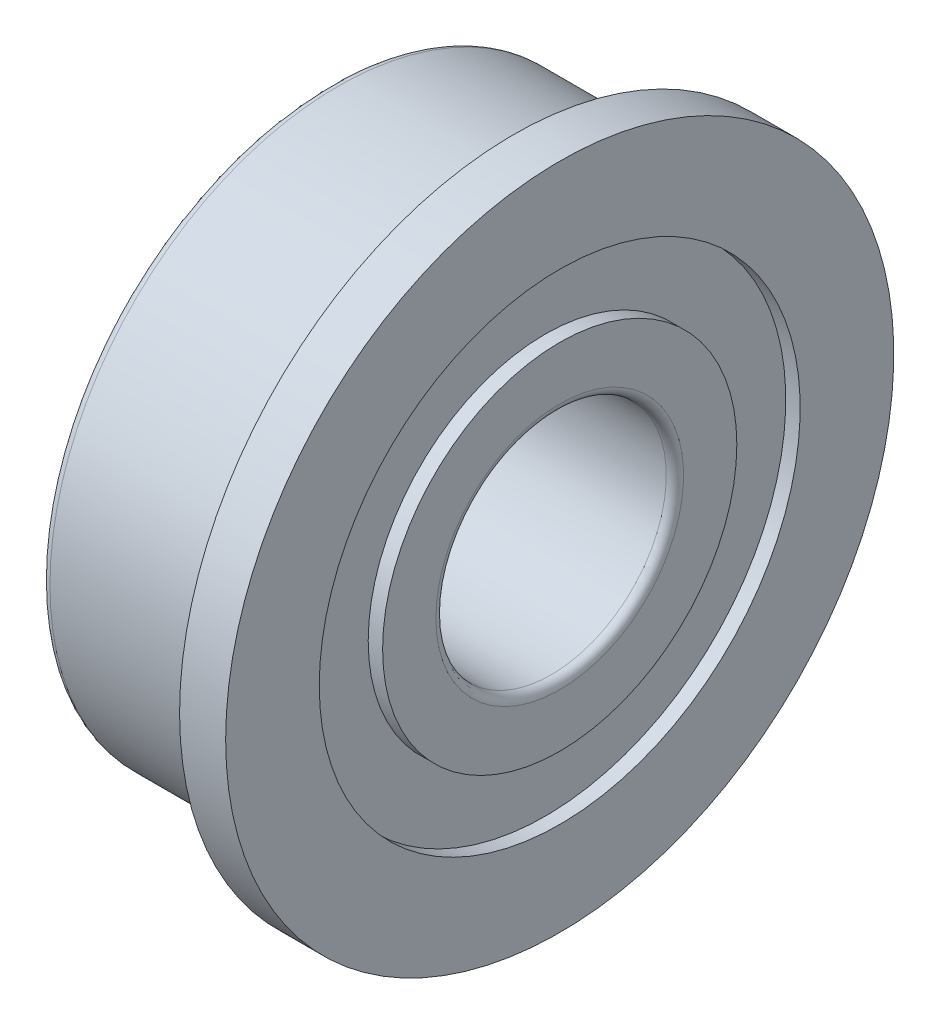
ISO-10303-21;
HEADER;
FILE_DESCRIPTION(('STEP AP214'),'2;1');
FILE_NAME('part.step','',(''),(''),'','','');
FILE_SCHEMA(('AUTOMOTIVE_DESIGN { 1 0 10303 214 1 1 1 1 }'));
ENDSEC;
DATA;
#1=APPLICATION_CONTEXT('core data for automotive mechanical design processes');
#2=APPLICATION_PROTOCOL_DEFINITION('international standard','automotive_design',2000,#1);
#3=PRODUCT_CONTEXT('',#1,'mechanical');
#4=PRODUCT('Part','Part','',(#3));
#5=PRODUCT_RELATED_PRODUCT_CATEGORY('part','',(#4));
#6=PRODUCT_DEFINITION_FORMATION('','',#4);
#7=PRODUCT_DEFINITION_CONTEXT('part definition',#1,'design');
#8=PRODUCT_DEFINITION('design','',#6,#7);
#9=PRODUCT_DEFINITION_SHAPE('','',#8);
#10=(LENGTH_UNIT() NAMED_UNIT(*) SI_UNIT(.MILLI.,.METRE.));
#11=(NAMED_UNIT(*) PLANE_ANGLE_UNIT() SI_UNIT($,.RADIAN.));
#12=(NAMED_UNIT(*) SI_UNIT($,.STERADIAN.) SOLID_ANGLE_UNIT());
#13=UNCERTAINTY_MEASURE_WITH_UNIT(LENGTH_MEASURE(1.E-05),#10,'distance_accuracy_value','');
#14=(GEOMETRIC_REPRESENTATION_CONTEXT(3) GLOBAL_UNCERTAINTY_ASSIGNED_CONTEXT((#13)) GLOBAL_UNIT_ASSIGNED_CONTEXT((#10,
#11,#12)) REPRESENTATION_CONTEXT('',''));
#15=CARTESIAN_POINT('',(0.,0.,0.));
#16=DIRECTION('',(0.,0.,1.));
#17=DIRECTION('',(1.,0.,0.));
#18=AXIS2_PLACEMENT_3D('',#15,#16,#17);
#19=CARTESIAN_POINT('',(0.14999999999997,0.,0.));
#20=DIRECTION('',(-1.,0.,0.));
#21=DIRECTION('',(0.,0.,1.));
#22=AXIS2_PLACEMENT_3D('',#19,#20,#21);
#23=TOROIDAL_SURFACE('',#22,4.85000000000003,0.14999999999997);
#24=CARTESIAN_POINT('',(0.,0.,0.));
#25=DIRECTION('',(-1.,0.,0.));
#26=DIRECTION('',(0.,0.,1.));
#27=AXIS2_PLACEMENT_3D('',#24,#25,#26);
#28=CIRCLE('',#27,4.85);
#29=CARTESIAN_POINT('',(0.,0.,4.85));
#30=VERTEX_POINT('',#29);
#31=EDGE_CURVE('E10',#30,#30,#28,.T.);
#32=ORIENTED_EDGE('',*,*,#31,.F.);
#33=EDGE_LOOP('',(#32));
#34=FACE_BOUND('',#33,.T.);
#35=CARTESIAN_POINT('',(0.150000000000001,0.,0.));
#36=DIRECTION('',(-1.,0.,0.));
#37=DIRECTION('',(0.,0.,1.));
#38=AXIS2_PLACEMENT_3D('',#35,#36,#37);
#39=CIRCLE('',#38,5.);
#40=CARTESIAN_POINT('',(0.150000000000001,0.,5.));
#41=VERTEX_POINT('',#40);
#42=EDGE_CURVE('E89',#41,#41,#39,.T.);
#43=ORIENTED_EDGE('',*,*,#42,.T.);
#44=EDGE_LOOP('',(#43));
#45=FACE_BOUND('',#44,.T.);
#46=ADVANCED_FACE('F31',(#34,#45),#23,.T.);
#47=CARTESIAN_POINT('',(0.,4.85,0.));
#48=DIRECTION('',(1.,0.,0.));
#49=DIRECTION('',(0.,0.,-1.));
#50=AXIS2_PLACEMENT_3D('',#47,#48,#49);
#51=PLANE('',#50);
#52=CARTESIAN_POINT('',(0.,0.,0.));
#53=DIRECTION('',(-1.,0.,0.));
#54=DIRECTION('',(0.,0.,1.));
#55=AXIS2_PLACEMENT_3D('',#52,#53,#54);
#56=CIRCLE('',#55,4.175);
#57=CARTESIAN_POINT('',(0.,0.,4.175));
#58=VERTEX_POINT('',#57);
#59=EDGE_CURVE('E37',#58,#58,#56,.T.);
#60=ORIENTED_EDGE('',*,*,#59,.F.);
#61=EDGE_LOOP('',(#60));
#62=FACE_BOUND('',#61,.T.);
#63=ORIENTED_EDGE('',*,*,#31,.T.);
#64=EDGE_LOOP('',(#63));
#65=FACE_BOUND('',#64,.T.);
#66=ADVANCED_FACE('F186',(#62,#65),#51,.F.);
#67=CARTESIAN_POINT('',(10.,0.,0.));
#68=DIRECTION('',(-1.,0.,0.));
#69=DIRECTION('',(0.,0.,1.));
#70=AXIS2_PLACEMENT_3D('',#67,#68,#69);
#71=CYLINDRICAL_SURFACE('',#70,4.175);
#72=CARTESIAN_POINT('',(0.25,0.,0.));
#73=DIRECTION('',(-1.,0.,0.));
#74=DIRECTION('',(0.,0.,1.));
#75=AXIS2_PLACEMENT_3D('',#72,#73,#74);
#76=CIRCLE('',#75,4.175);
#77=CARTESIAN_POINT('',(0.25,0.,4.175));
#78=VERTEX_POINT('',#77);
#79=EDGE_CURVE('E41',#78,#78,#76,.T.);
#80=ORIENTED_EDGE('',*,*,#79,.F.);
#81=EDGE_LOOP('',(#80));
#82=FACE_BOUND('',#81,.T.);
#83=ORIENTED_EDGE('',*,*,#59,.T.);
#84=EDGE_LOOP('',(#83));
#85=FACE_BOUND('',#84,.T.);
#86=ADVANCED_FACE('F181',(#82,#85),#71,.F.);
#87=CARTESIAN_POINT('',(0.25,4.175,0.));
#88=DIRECTION('',(1.,0.,0.));
#89=DIRECTION('',(0.,0.,-1.));
#90=AXIS2_PLACEMENT_3D('',#87,#88,#89);
#91=PLANE('',#90);
#92=CARTESIAN_POINT('',(0.25,0.,0.));
#93=DIRECTION('',(-1.,0.,0.));
#94=DIRECTION('',(0.,0.,1.));
#95=AXIS2_PLACEMENT_3D('',#92,#93,#94);
#96=CIRCLE('',#95,3.075);
#97=CARTESIAN_POINT('',(0.25,0.,3.075));
#98=VERTEX_POINT('',#97);
#99=EDGE_CURVE('E45',#98,#98,#96,.T.);
#100=ORIENTED_EDGE('',*,*,#99,.F.);
#101=EDGE_LOOP('',(#100));
#102=FACE_BOUND('',#101,.T.);
#103=ORIENTED_EDGE('',*,*,#79,.T.);
#104=EDGE_LOOP('',(#103));
#105=FACE_BOUND('',#104,.T.);
#106=ADVANCED_FACE('F175',(#102,#105),#91,.F.);
#107=CARTESIAN_POINT('',(10.,0.,0.));
#108=DIRECTION('',(-1.,0.,0.));
#109=DIRECTION('',(0.,0.,1.));
#110=AXIS2_PLACEMENT_3D('',#107,#108,#109);
#111=CYLINDRICAL_SURFACE('',#110,3.075);
#112=CARTESIAN_POINT('',(0.,0.,0.));
#113=DIRECTION('',(-1.,0.,0.));
#114=DIRECTION('',(0.,0.,1.));
#115=AXIS2_PLACEMENT_3D('',#112,#113,#114);
#116=CIRCLE('',#115,3.075);
#117=CARTESIAN_POINT('',(0.,0.,3.075));
#118=VERTEX_POINT('',#117);
#119=EDGE_CURVE('E50',#118,#118,#116,.T.);
#120=ORIENTED_EDGE('',*,*,#119,.F.);
#121=EDGE_LOOP('',(#120));
#122=FACE_BOUND('',#121,.T.);
#123=ORIENTED_EDGE('',*,*,#99,.T.);
#124=EDGE_LOOP('',(#123));
#125=FACE_BOUND('',#124,.T.);
#126=ADVANCED_FACE('F169',(#122,#125),#111,.T.);
#127=CARTESIAN_POINT('',(0.,3.075,0.));
#128=DIRECTION('',(1.,0.,0.));
#129=DIRECTION('',(0.,0.,-1.));
#130=AXIS2_PLACEMENT_3D('',#127,#128,#129);
#131=PLANE('',#130);
#132=CARTESIAN_POINT('',(0.,0.,0.));
#133=DIRECTION('',(-1.,0.,0.));
#134=DIRECTION('',(0.,0.,1.));
#135=AXIS2_PLACEMENT_3D('',#132,#133,#134);
#136=CIRCLE('',#135,2.15);
#137=CARTESIAN_POINT('',(0.,0.,2.15));
#138=VERTEX_POINT('',#137);
#139=EDGE_CURVE('E53',#138,#138,#136,.T.);
#140=ORIENTED_EDGE('',*,*,#139,.F.);
#141=EDGE_LOOP('',(#140));
#142=FACE_BOUND('',#141,.T.);
#143=ORIENTED_EDGE('',*,*,#119,.T.);
#144=EDGE_LOOP('',(#143));
#145=FACE_BOUND('',#144,.T.);
#146=ADVANCED_FACE('F163',(#142,#145),#131,.F.);
#147=CARTESIAN_POINT('',(0.149999999999969,0.,0.));
#148=DIRECTION('',(-1.,0.,0.));
#149=DIRECTION('',(0.,0.,1.));
#150=AXIS2_PLACEMENT_3D('',#147,#148,#149);
#151=TOROIDAL_SURFACE('',#150,2.14999999999997,0.149999999999969);
#152=CARTESIAN_POINT('',(0.150000000000001,0.,0.));
#153=DIRECTION('',(-1.,0.,0.));
#154=DIRECTION('',(0.,0.,1.));
#155=AXIS2_PLACEMENT_3D('',#152,#153,#154);
#156=CIRCLE('',#155,2.);
#157=CARTESIAN_POINT('',(0.150000000000001,0.,2.));
#158=VERTEX_POINT('',#157);
#159=EDGE_CURVE('E56',#158,#158,#156,.T.);
#160=ORIENTED_EDGE('',*,*,#159,.F.);
#161=EDGE_LOOP('',(#160));
#162=FACE_BOUND('',#161,.T.);
#163=ORIENTED_EDGE('',*,*,#139,.T.);
#164=EDGE_LOOP('',(#163));
#165=FACE_BOUND('',#164,.T.);
#166=ADVANCED_FACE('F157',(#162,#165),#151,.T.);
#167=CARTESIAN_POINT('',(10.,0.,0.));
#168=DIRECTION('',(-1.,0.,0.));
#169=DIRECTION('',(0.,0.,1.));
#170=AXIS2_PLACEMENT_3D('',#167,#168,#169);
#171=CYLINDRICAL_SURFACE('',#170,2.);
#172=CARTESIAN_POINT('',(3.85,0.,0.));
#173=DIRECTION('',(-1.,0.,0.));
#174=DIRECTION('',(0.,0.,1.));
#175=AXIS2_PLACEMENT_3D('',#172,#173,#174);
#176=CIRCLE('',#175,2.);
#177=CARTESIAN_POINT('',(3.85,0.,2.));
#178=VERTEX_POINT('',#177);
#179=EDGE_CURVE('E59',#178,#178,#176,.T.);
#180=ORIENTED_EDGE('',*,*,#179,.F.);
#181=EDGE_LOOP('',(#180));
#182=FACE_BOUND('',#181,.T.);
#183=ORIENTED_EDGE('',*,*,#159,.T.);
#184=EDGE_LOOP('',(#183));
#185=FACE_BOUND('',#184,.T.);
#186=ADVANCED_FACE('F151',(#182,#185),#171,.F.);
#187=CARTESIAN_POINT('',(3.85000000000006,0.,0.));
#188=DIRECTION('',(-1.,0.,0.));
#189=DIRECTION('',(0.,0.,1.));
#190=AXIS2_PLACEMENT_3D('',#187,#188,#189);
#191=TOROIDAL_SURFACE('',#190,2.14999999999994,0.149999999999939);
#192=CARTESIAN_POINT('',(4.,0.,0.));
#193=DIRECTION('',(-1.,0.,0.));
#194=DIRECTION('',(0.,0.,1.));
#195=AXIS2_PLACEMENT_3D('',#192,#193,#194);
#196=CIRCLE('',#195,2.15);
#197=CARTESIAN_POINT('',(4.,0.,2.15));
#198=VERTEX_POINT('',#197);
#199=EDGE_CURVE('E62',#198,#198,#196,.T.);
#200=ORIENTED_EDGE('',*,*,#199,.F.);
#201=EDGE_LOOP('',(#200));
#202=FACE_BOUND('',#201,.T.);
#203=ORIENTED_EDGE('',*,*,#179,.T.);
#204=EDGE_LOOP('',(#203));
#205=FACE_BOUND('',#204,.T.);
#206=ADVANCED_FACE('F145',(#202,#205),#191,.T.);
#207=CARTESIAN_POINT('',(4.,2.15,0.));
#208=DIRECTION('',(-1.,0.,0.));
#209=DIRECTION('',(0.,0.,1.));
#210=AXIS2_PLACEMENT_3D('',#207,#208,#209);
#211=PLANE('',#210);
#212=CARTESIAN_POINT('',(4.,0.,0.));
#213=DIRECTION('',(-1.,0.,0.));
#214=DIRECTION('',(0.,0.,1.));
#215=AXIS2_PLACEMENT_3D('',#212,#213,#214);
#216=CIRCLE('',#215,3.075);
#217=CARTESIAN_POINT('',(4.,0.,3.075));
#218=VERTEX_POINT('',#217);
#219=EDGE_CURVE('E65',#218,#218,#216,.T.);
#220=ORIENTED_EDGE('',*,*,#219,.F.);
#221=EDGE_LOOP('',(#220));
#222=FACE_BOUND('',#221,.T.);
#223=ORIENTED_EDGE('',*,*,#199,.T.);
#224=EDGE_LOOP('',(#223));
#225=FACE_BOUND('',#224,.T.);
#226=ADVANCED_FACE('F139',(#222,#225),#211,.F.);
#227=CARTESIAN_POINT('',(10.,0.,0.));
#228=DIRECTION('',(-1.,0.,0.));
#229=DIRECTION('',(0.,0.,1.));
#230=AXIS2_PLACEMENT_3D('',#227,#228,#229);
#231=CYLINDRICAL_SURFACE('',#230,3.075);
#232=CARTESIAN_POINT('',(3.75,0.,0.));
#233=DIRECTION('',(-1.,0.,0.));
#234=DIRECTION('',(0.,0.,1.));
#235=AXIS2_PLACEMENT_3D('',#232,#233,#234);
#236=CIRCLE('',#235,3.075);
#237=CARTESIAN_POINT('',(3.75,0.,3.075));
#238=VERTEX_POINT('',#237);
#239=EDGE_CURVE('E68',#238,#238,#236,.T.);
#240=ORIENTED_EDGE('',*,*,#239,.F.);
#241=EDGE_LOOP('',(#240));
#242=FACE_BOUND('',#241,.T.);
#243=ORIENTED_EDGE('',*,*,#219,.T.);
#244=EDGE_LOOP('',(#243));
#245=FACE_BOUND('',#244,.T.);
#246=ADVANCED_FACE('F133',(#242,#245),#231,.T.);
#247=CARTESIAN_POINT('',(3.75,3.075,0.));
#248=DIRECTION('',(-1.,0.,0.));
#249=DIRECTION('',(0.,0.,1.));
#250=AXIS2_PLACEMENT_3D('',#247,#248,#249);
#251=PLANE('',#250);
#252=CARTESIAN_POINT('',(3.75,0.,0.));
#253=DIRECTION('',(-1.,0.,0.));
#254=DIRECTION('',(0.,0.,1.));
#255=AXIS2_PLACEMENT_3D('',#252,#253,#254);
#256=CIRCLE('',#255,4.175);
#257=CARTESIAN_POINT('',(3.75,0.,4.175));
#258=VERTEX_POINT('',#257);
#259=EDGE_CURVE('E71',#258,#258,#256,.T.);
#260=ORIENTED_EDGE('',*,*,#259,.F.);
#261=EDGE_LOOP('',(#260));
#262=FACE_BOUND('',#261,.T.);
#263=ORIENTED_EDGE('',*,*,#239,.T.);
#264=EDGE_LOOP('',(#263));
#265=FACE_BOUND('',#264,.T.);
#266=ADVANCED_FACE('F127',(#262,#265),#251,.F.);
#267=CARTESIAN_POINT('',(10.,0.,0.));
#268=DIRECTION('',(-1.,0.,0.));
#269=DIRECTION('',(0.,0.,1.));
#270=AXIS2_PLACEMENT_3D('',#267,#268,#269);
#271=CYLINDRICAL_SURFACE('',#270,4.175);
#272=CARTESIAN_POINT('',(4.,0.,0.));
#273=DIRECTION('',(-1.,0.,0.));
#274=DIRECTION('',(0.,0.,1.));
#275=AXIS2_PLACEMENT_3D('',#272,#273,#274);
#276=CIRCLE('',#275,4.175);
#277=CARTESIAN_POINT('',(4.,0.,4.175));
#278=VERTEX_POINT('',#277);
#279=EDGE_CURVE('E74',#278,#278,#276,.T.);
#280=ORIENTED_EDGE('',*,*,#279,.F.);
#281=EDGE_LOOP('',(#280));
#282=FACE_BOUND('',#281,.T.);
#283=ORIENTED_EDGE('',*,*,#259,.T.);
#284=EDGE_LOOP('',(#283));
#285=FACE_BOUND('',#284,.T.);
#286=ADVANCED_FACE('F121',(#282,#285),#271,.F.);
#287=CARTESIAN_POINT('',(4.,4.175,0.));
#288=DIRECTION('',(-1.,0.,0.));
#289=DIRECTION('',(0.,0.,1.));
#290=AXIS2_PLACEMENT_3D('',#287,#288,#289);
#291=PLANE('',#290);
#292=CARTESIAN_POINT('',(4.,0.,0.));
#293=DIRECTION('',(-1.,0.,0.));
#294=DIRECTION('',(0.,0.,1.));
#295=AXIS2_PLACEMENT_3D('',#292,#293,#294);
#296=CIRCLE('',#295,5.8);
#297=CARTESIAN_POINT('',(4.,0.,5.8));
#298=VERTEX_POINT('',#297);
#299=EDGE_CURVE('E77',#298,#298,#296,.T.);
#300=ORIENTED_EDGE('',*,*,#299,.F.);
#301=EDGE_LOOP('',(#300));
#302=FACE_BOUND('',#301,.T.);
#303=ORIENTED_EDGE('',*,*,#279,.T.);
#304=EDGE_LOOP('',(#303));
#305=FACE_BOUND('',#304,.T.);
#306=ADVANCED_FACE('F115',(#302,#305),#291,.F.);
#307=CARTESIAN_POINT('',(10.,0.,0.));
#308=DIRECTION('',(-1.,0.,0.));
#309=DIRECTION('',(0.,0.,1.));
#310=AXIS2_PLACEMENT_3D('',#307,#308,#309);
#311=CYLINDRICAL_SURFACE('',#310,5.8);
#312=CARTESIAN_POINT('',(3.2,0.,0.));
#313=DIRECTION('',(-1.,0.,0.));
#314=DIRECTION('',(0.,0.,1.));
#315=AXIS2_PLACEMENT_3D('',#312,#313,#314);
#316=CIRCLE('',#315,5.8);
#317=CARTESIAN_POINT('',(3.2,0.,5.8));
#318=VERTEX_POINT('',#317);
#319=EDGE_CURVE('E80',#318,#318,#316,.T.);
#320=ORIENTED_EDGE('',*,*,#319,.F.);
#321=EDGE_LOOP('',(#320));
#322=FACE_BOUND('',#321,.T.);
#323=ORIENTED_EDGE('',*,*,#299,.T.);
#324=EDGE_LOOP('',(#323));
#325=FACE_BOUND('',#324,.T.);
#326=ADVANCED_FACE('F109',(#322,#325),#311,.T.);
#327=CARTESIAN_POINT('',(3.2,5.8,0.));
#328=DIRECTION('',(1.,0.,0.));
#329=DIRECTION('',(0.,0.,-1.));
#330=AXIS2_PLACEMENT_3D('',#327,#328,#329);
#331=PLANE('',#330);
#332=CARTESIAN_POINT('',(3.2,0.,0.));
#333=DIRECTION('',(-1.,0.,0.));
#334=DIRECTION('',(0.,0.,1.));
#335=AXIS2_PLACEMENT_3D('',#332,#333,#334);
#336=CIRCLE('',#335,5.2);
#337=CARTESIAN_POINT('',(3.2,0.,5.2));
#338=VERTEX_POINT('',#337);
#339=EDGE_CURVE('E83',#338,#338,#336,.T.);
#340=ORIENTED_EDGE('',*,*,#339,.F.);
#341=EDGE_LOOP('',(#340));
#342=FACE_BOUND('',#341,.T.);
#343=ORIENTED_EDGE('',*,*,#319,.T.);
#344=EDGE_LOOP('',(#343));
#345=FACE_BOUND('',#344,.T.);
#346=ADVANCED_FACE('F103',(#342,#345),#331,.F.);
#347=CARTESIAN_POINT('',(3.19999999999999,0.,0.));
#348=DIRECTION('',(-1.,0.,0.));
#349=DIRECTION('',(0.,0.,1.));
#350=AXIS2_PLACEMENT_3D('',#347,#348,#349);
#351=TOROIDAL_SURFACE('',#350,5.00000000000001,0.199999999999995);
#352=CARTESIAN_POINT('',(3.,0.,0.));
#353=DIRECTION('',(-1.,0.,0.));
#354=DIRECTION('',(0.,0.,1.));
#355=AXIS2_PLACEMENT_3D('',#352,#353,#354);
#356=CIRCLE('',#355,5.);
#357=CARTESIAN_POINT('',(3.,0.,5.));
#358=VERTEX_POINT('',#357);
#359=EDGE_CURVE('E86',#358,#358,#356,.T.);
#360=ORIENTED_EDGE('',*,*,#359,.F.);
#361=EDGE_LOOP('',(#360));
#362=FACE_BOUND('',#361,.T.);
#363=ORIENTED_EDGE('',*,*,#339,.T.);
#364=EDGE_LOOP('',(#363));
#365=FACE_BOUND('',#364,.T.);
#366=ADVANCED_FACE('F97',(#362,#365),#351,.F.);
#367=CARTESIAN_POINT('',(10.,0.,0.));
#368=DIRECTION('',(-1.,0.,0.));
#369=DIRECTION('',(0.,0.,1.));
#370=AXIS2_PLACEMENT_3D('',#367,#368,#369);
#371=CYLINDRICAL_SURFACE('',#370,5.);
#372=ORIENTED_EDGE('',*,*,#42,.F.);
#373=EDGE_LOOP('',(#372));
#374=FACE_BOUND('',#373,.T.);
#375=ORIENTED_EDGE('',*,*,#359,.T.);
#376=EDGE_LOOP('',(#375));
#377=FACE_BOUND('',#376,.T.);
#378=ADVANCED_FACE('F94',(#374,#377),#371,.T.);
#379=CLOSED_SHELL('',(#46,#66,#86,#106,#126,#146,#166,#186,#206,#226,#246,#266,#286,#306,#326,
#346,#366,#378));
#380=MANIFOLD_SOLID_BREP('B2',#379);
#381=ADVANCED_BREP_SHAPE_REPRESENTATION('',(#18,#380),#14);
#382=SHAPE_DEFINITION_REPRESENTATION(#9,#381);
ENDSEC;
END-ISO-10303-21;
